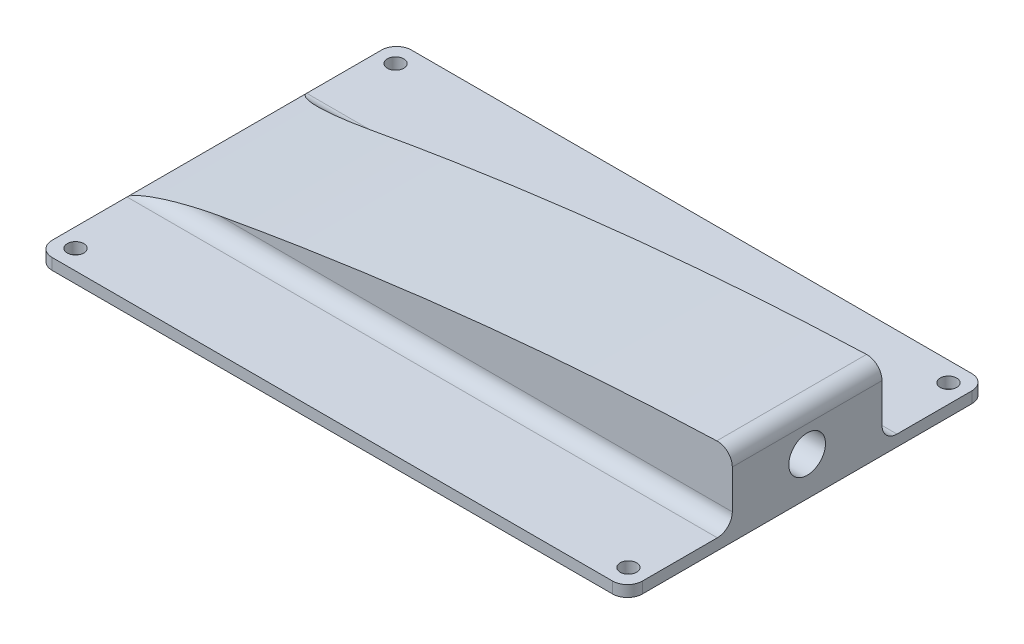
ISO-10303-21;
HEADER;
FILE_DESCRIPTION(('STEP AP214'),'2;1');
FILE_NAME('part.step','',(''),(''),'','','');
FILE_SCHEMA(('AUTOMOTIVE_DESIGN { 1 0 10303 214 1 1 1 1 }'));
ENDSEC;
DATA;
#1=APPLICATION_CONTEXT('core data for automotive mechanical design processes');
#2=APPLICATION_PROTOCOL_DEFINITION('international standard','automotive_design',2000,#1);
#3=PRODUCT_CONTEXT('',#1,'mechanical');
#4=PRODUCT('Part','Part','',(#3));
#5=PRODUCT_RELATED_PRODUCT_CATEGORY('part','',(#4));
#6=PRODUCT_DEFINITION_FORMATION('','',#4);
#7=PRODUCT_DEFINITION_CONTEXT('part definition',#1,'design');
#8=PRODUCT_DEFINITION('design','',#6,#7);
#9=PRODUCT_DEFINITION_SHAPE('','',#8);
#10=(LENGTH_UNIT() NAMED_UNIT(*) SI_UNIT(.MILLI.,.METRE.));
#11=(NAMED_UNIT(*) PLANE_ANGLE_UNIT() SI_UNIT($,.RADIAN.));
#12=(NAMED_UNIT(*) SI_UNIT($,.STERADIAN.) SOLID_ANGLE_UNIT());
#13=UNCERTAINTY_MEASURE_WITH_UNIT(LENGTH_MEASURE(1.E-05),#10,'distance_accuracy_value','');
#14=(GEOMETRIC_REPRESENTATION_CONTEXT(3) GLOBAL_UNCERTAINTY_ASSIGNED_CONTEXT((#13)) GLOBAL_UNIT_ASSIGNED_CONTEXT((#10,
#11,#12)) REPRESENTATION_CONTEXT('',''));
#15=CARTESIAN_POINT('',(0.,0.,0.));
#16=DIRECTION('',(0.,0.,1.));
#17=DIRECTION('',(1.,0.,0.));
#18=AXIS2_PLACEMENT_3D('',#15,#16,#17);
#19=CARTESIAN_POINT('',(0.,1.5,0.));
#20=DIRECTION('',(0.,1.,0.));
#21=DIRECTION('',(0.,0.,1.));
#22=AXIS2_PLACEMENT_3D('',#19,#20,#21);
#23=PLANE('',#22);
#24=CARTESIAN_POINT('',(-36.93,1.5,-21.375));
#25=DIRECTION('',(0.,1.,0.));
#26=DIRECTION('',(0.,0.,1.));
#27=AXIS2_PLACEMENT_3D('',#24,#25,#26);
#28=CIRCLE('',#27,1.1);
#29=CARTESIAN_POINT('',(-36.93,1.5,-20.275));
#30=VERTEX_POINT('',#29);
#31=EDGE_CURVE('E174',#30,#30,#28,.T.);
#32=ORIENTED_EDGE('',*,*,#31,.F.);
#33=EDGE_LOOP('',(#32));
#34=FACE_BOUND('',#33,.T.);
#35=CARTESIAN_POINT('',(36.93,1.5,-21.375));
#36=DIRECTION('',(0.,1.,0.));
#37=DIRECTION('',(0.,0.,1.));
#38=AXIS2_PLACEMENT_3D('',#35,#36,#37);
#39=CIRCLE('',#38,1.1);
#40=CARTESIAN_POINT('',(36.93,1.5,-20.275));
#41=VERTEX_POINT('',#40);
#42=EDGE_CURVE('E276',#41,#41,#39,.T.);
#43=ORIENTED_EDGE('',*,*,#42,.F.);
#44=EDGE_LOOP('',(#43));
#45=FACE_BOUND('',#44,.T.);
#46=DIRECTION('',(0.,0.,1.));
#47=VECTOR('',#46,1.);
#48=CARTESIAN_POINT('',(-39.43,1.5,24.));
#49=LINE('',#48,#47);
#50=CARTESIAN_POINT('',(-39.43,1.5,-22.));
#51=VERTEX_POINT('',#50);
#52=CARTESIAN_POINT('',(-39.43,1.5,-12.));
#53=VERTEX_POINT('',#52);
#54=EDGE_CURVE('E161',#51,#53,#49,.T.);
#55=ORIENTED_EDGE('',*,*,#54,.T.);
#56=DIRECTION('',(1.,0.,0.));
#57=VECTOR('',#56,1.);
#58=CARTESIAN_POINT('',(0.,1.5,-12.));
#59=LINE('',#58,#57);
#60=CARTESIAN_POINT('',(39.43,1.5,-12.));
#61=VERTEX_POINT('',#60);
#62=EDGE_CURVE('E212',#53,#61,#59,.T.);
#63=ORIENTED_EDGE('',*,*,#62,.T.);
#64=DIRECTION('',(0.,0.,-1.));
#65=VECTOR('',#64,1.);
#66=CARTESIAN_POINT('',(39.43,1.5,24.));
#67=LINE('',#66,#65);
#68=CARTESIAN_POINT('',(39.43,1.5,-22.));
#69=VERTEX_POINT('',#68);
#70=EDGE_CURVE('E288',#61,#69,#67,.T.);
#71=ORIENTED_EDGE('',*,*,#70,.T.);
#72=CARTESIAN_POINT('',(37.43,1.5,-22.));
#73=DIRECTION('',(0.,1.,0.));
#74=DIRECTION('',(0.,0.,1.));
#75=AXIS2_PLACEMENT_3D('',#72,#73,#74);
#76=CIRCLE('',#75,2.);
#77=CARTESIAN_POINT('',(37.43,1.5,-24.));
#78=VERTEX_POINT('',#77);
#79=EDGE_CURVE('E197',#69,#78,#76,.T.);
#80=ORIENTED_EDGE('',*,*,#79,.T.);
#81=DIRECTION('',(-1.,0.,0.));
#82=VECTOR('',#81,1.);
#83=CARTESIAN_POINT('',(39.43,1.5,-24.));
#84=LINE('',#83,#82);
#85=CARTESIAN_POINT('',(-37.43,1.5,-24.));
#86=VERTEX_POINT('',#85);
#87=EDGE_CURVE('E177',#78,#86,#84,.T.);
#88=ORIENTED_EDGE('',*,*,#87,.T.);
#89=CARTESIAN_POINT('',(-37.43,1.5,-22.));
#90=DIRECTION('',(0.,1.,0.));
#91=DIRECTION('',(0.,0.,1.));
#92=AXIS2_PLACEMENT_3D('',#89,#90,#91);
#93=CIRCLE('',#92,2.);
#94=EDGE_CURVE('E199',#86,#51,#93,.T.);
#95=ORIENTED_EDGE('',*,*,#94,.T.);
#96=EDGE_LOOP('',(#55,#63,#71,#80,#88,#95));
#97=FACE_BOUND('',#96,.T.);
#98=ADVANCED_FACE('F41',(#34,#45,#97),#23,.T.);
#99=CARTESIAN_POINT('',(-39.43,1.5,24.));
#100=DIRECTION('',(1.,0.,0.));
#101=DIRECTION('',(0.,0.,-1.));
#102=AXIS2_PLACEMENT_3D('',#99,#100,#101);
#103=PLANE('',#102);
#104=DIRECTION('',(0.,0.,1.));
#105=VECTOR('',#104,1.);
#106=CARTESIAN_POINT('',(-39.43,1.5,-10.));
#107=LINE('',#106,#105);
#108=CARTESIAN_POINT('',(-39.43,1.5,12.));
#109=VERTEX_POINT('',#108);
#110=EDGE_CURVE('E258',#53,#109,#107,.T.);
#111=ORIENTED_EDGE('',*,*,#110,.F.);
#112=ORIENTED_EDGE('',*,*,#54,.F.);
#113=DIRECTION('',(0.,-1.,0.));
#114=VECTOR('',#113,1.);
#115=CARTESIAN_POINT('',(-39.43,1.5,-22.));
#116=LINE('',#115,#114);
#117=CARTESIAN_POINT('',(-39.43,0.,-22.));
#118=VERTEX_POINT('',#117);
#119=EDGE_CURVE('E144',#51,#118,#116,.T.);
#120=ORIENTED_EDGE('',*,*,#119,.T.);
#121=DIRECTION('',(0.,0.,1.));
#122=VECTOR('',#121,1.);
#123=CARTESIAN_POINT('',(-39.43,0.,24.));
#124=LINE('',#123,#122);
#125=CARTESIAN_POINT('',(-39.43,0.,22.));
#126=VERTEX_POINT('',#125);
#127=EDGE_CURVE('E158',#118,#126,#124,.T.);
#128=ORIENTED_EDGE('',*,*,#127,.T.);
#129=DIRECTION('',(0.,-1.,0.));
#130=VECTOR('',#129,1.);
#131=CARTESIAN_POINT('',(-39.43,1.5,22.));
#132=LINE('',#131,#130);
#133=CARTESIAN_POINT('',(-39.43,1.5,22.));
#134=VERTEX_POINT('',#133);
#135=EDGE_CURVE('E163',#126,#134,#132,.F.);
#136=ORIENTED_EDGE('',*,*,#135,.T.);
#137=EDGE_CURVE('E184',#109,#134,#49,.T.);
#138=ORIENTED_EDGE('',*,*,#137,.F.);
#139=EDGE_LOOP('',(#111,#112,#120,#128,#136,#138));
#140=FACE_BOUND('',#139,.T.);
#141=ADVANCED_FACE('F156',(#140),#103,.F.);
#142=CARTESIAN_POINT('',(39.43,1.5,24.));
#143=DIRECTION('',(0.,0.,-1.));
#144=DIRECTION('',(-1.,0.,0.));
#145=AXIS2_PLACEMENT_3D('',#142,#143,#144);
#146=PLANE('',#145);
#147=DIRECTION('',(1.,0.,0.));
#148=VECTOR('',#147,1.);
#149=CARTESIAN_POINT('',(39.43,0.,24.));
#150=LINE('',#149,#148);
#151=CARTESIAN_POINT('',(-37.43,0.,24.));
#152=VERTEX_POINT('',#151);
#153=CARTESIAN_POINT('',(37.43,0.,24.));
#154=VERTEX_POINT('',#153);
#155=EDGE_CURVE('E167',#152,#154,#150,.T.);
#156=ORIENTED_EDGE('',*,*,#155,.T.);
#157=DIRECTION('',(0.,-1.,0.));
#158=VECTOR('',#157,1.);
#159=CARTESIAN_POINT('',(37.43,1.5,24.));
#160=LINE('',#159,#158);
#161=CARTESIAN_POINT('',(37.43,1.5,24.));
#162=VERTEX_POINT('',#161);
#163=EDGE_CURVE('E210',#154,#162,#160,.F.);
#164=ORIENTED_EDGE('',*,*,#163,.T.);
#165=DIRECTION('',(1.,0.,0.));
#166=VECTOR('',#165,1.);
#167=CARTESIAN_POINT('',(39.43,1.5,24.));
#168=LINE('',#167,#166);
#169=CARTESIAN_POINT('',(-37.43,1.5,24.));
#170=VERTEX_POINT('',#169);
#171=EDGE_CURVE('E286',#170,#162,#168,.T.);
#172=ORIENTED_EDGE('',*,*,#171,.F.);
#173=DIRECTION('',(0.,-1.,0.));
#174=VECTOR('',#173,1.);
#175=CARTESIAN_POINT('',(-37.43,1.5,24.));
#176=LINE('',#175,#174);
#177=EDGE_CURVE('E207',#170,#152,#176,.T.);
#178=ORIENTED_EDGE('',*,*,#177,.T.);
#179=EDGE_LOOP('',(#156,#164,#172,#178));
#180=FACE_BOUND('',#179,.T.);
#181=ADVANCED_FACE('F314',(#180),#146,.F.);
#182=CARTESIAN_POINT('',(39.43,1.5,24.));
#183=DIRECTION('',(-1.,0.,0.));
#184=DIRECTION('',(0.,0.,1.));
#185=AXIS2_PLACEMENT_3D('',#182,#183,#184);
#186=PLANE('',#185);
#187=CARTESIAN_POINT('',(39.43,5.18228709577426,0.));
#188=DIRECTION('',(1.,0.,0.));
#189=DIRECTION('',(0.,0.,-1.));
#190=AXIS2_PLACEMENT_3D('',#187,#188,#189);
#191=CIRCLE('',#190,2.45);
#192=CARTESIAN_POINT('',(39.43,5.18228709577426,-2.45));
#193=VERTEX_POINT('',#192);
#194=EDGE_CURVE('E396',#193,#193,#191,.T.);
#195=ORIENTED_EDGE('',*,*,#194,.F.);
#196=EDGE_LOOP('',(#195));
#197=FACE_BOUND('',#196,.T.);
#198=DIRECTION('',(0.,1.,0.));
#199=VECTOR('',#198,1.);
#200=CARTESIAN_POINT('',(39.43,0.75,-10.));
#201=LINE('',#200,#199);
#202=CARTESIAN_POINT('',(39.43,3.5,-10.));
#203=VERTEX_POINT('',#202);
#204=CARTESIAN_POINT('',(39.43,8.68228709577425,-10.));
#205=VERTEX_POINT('',#204);
#206=EDGE_CURVE('E259',#203,#205,#201,.T.);
#207=ORIENTED_EDGE('',*,*,#206,.T.);
#208=DIRECTION('',(0.,0.,-1.));
#209=VECTOR('',#208,1.);
#210=CARTESIAN_POINT('',(39.43,8.68228709577425,10.));
#211=LINE('',#210,#209);
#212=CARTESIAN_POINT('',(39.43,8.68228709577425,10.));
#213=VERTEX_POINT('',#212);
#214=EDGE_CURVE('E328',#205,#213,#211,.F.);
#215=ORIENTED_EDGE('',*,*,#214,.T.);
#216=DIRECTION('',(0.,1.,0.));
#217=VECTOR('',#216,1.);
#218=CARTESIAN_POINT('',(39.43,0.75,10.));
#219=LINE('',#218,#217);
#220=CARTESIAN_POINT('',(39.43,3.5,10.));
#221=VERTEX_POINT('',#220);
#222=EDGE_CURVE('E323',#221,#213,#219,.T.);
#223=ORIENTED_EDGE('',*,*,#222,.F.);
#224=CARTESIAN_POINT('',(39.43,3.5,12.));
#225=DIRECTION('',(-1.,0.,0.));
#226=DIRECTION('',(0.,0.,1.));
#227=AXIS2_PLACEMENT_3D('',#224,#225,#226);
#228=CIRCLE('',#227,2.);
#229=CARTESIAN_POINT('',(39.43,1.5,12.));
#230=VERTEX_POINT('',#229);
#231=EDGE_CURVE('E235',#221,#230,#228,.T.);
#232=ORIENTED_EDGE('',*,*,#231,.T.);
#233=CARTESIAN_POINT('',(39.43,1.5,22.));
#234=VERTEX_POINT('',#233);
#235=EDGE_CURVE('E289',#234,#230,#67,.T.);
#236=ORIENTED_EDGE('',*,*,#235,.F.);
#237=DIRECTION('',(0.,-1.,0.));
#238=VECTOR('',#237,1.);
#239=CARTESIAN_POINT('',(39.43,1.5,22.));
#240=LINE('',#239,#238);
#241=CARTESIAN_POINT('',(39.43,0.,22.));
#242=VERTEX_POINT('',#241);
#243=EDGE_CURVE('E201',#234,#242,#240,.T.);
#244=ORIENTED_EDGE('',*,*,#243,.T.);
#245=DIRECTION('',(0.,0.,-1.));
#246=VECTOR('',#245,1.);
#247=CARTESIAN_POINT('',(39.43,0.,24.));
#248=LINE('',#247,#246);
#249=CARTESIAN_POINT('',(39.43,0.,-22.));
#250=VERTEX_POINT('',#249);
#251=EDGE_CURVE('E171',#242,#250,#248,.T.);
#252=ORIENTED_EDGE('',*,*,#251,.T.);
#253=DIRECTION('',(0.,-1.,0.));
#254=VECTOR('',#253,1.);
#255=CARTESIAN_POINT('',(39.43,1.5,-22.));
#256=LINE('',#255,#254);
#257=EDGE_CURVE('E204',#250,#69,#256,.F.);
#258=ORIENTED_EDGE('',*,*,#257,.T.);
#259=ORIENTED_EDGE('',*,*,#70,.F.);
#260=CARTESIAN_POINT('',(39.43,3.5,-12.));
#261=DIRECTION('',(-1.,0.,0.));
#262=DIRECTION('',(0.,0.,1.));
#263=AXIS2_PLACEMENT_3D('',#260,#261,#262);
#264=CIRCLE('',#263,2.);
#265=EDGE_CURVE('E224',#61,#203,#264,.T.);
#266=ORIENTED_EDGE('',*,*,#265,.T.);
#267=EDGE_LOOP('',(#207,#215,#223,#232,#236,#244,#252,#258,#259,#266));
#268=FACE_BOUND('',#267,.T.);
#269=ADVANCED_FACE('F303',(#197,#268),#186,.F.);
#270=CARTESIAN_POINT('',(39.43,1.5,-24.));
#271=DIRECTION('',(0.,0.,1.));
#272=DIRECTION('',(1.,0.,0.));
#273=AXIS2_PLACEMENT_3D('',#270,#271,#272);
#274=PLANE('',#273);
#275=DIRECTION('',(-1.,0.,0.));
#276=VECTOR('',#275,1.);
#277=CARTESIAN_POINT('',(39.43,0.,-24.));
#278=LINE('',#277,#276);
#279=CARTESIAN_POINT('',(37.43,0.,-24.));
#280=VERTEX_POINT('',#279);
#281=CARTESIAN_POINT('',(-37.43,0.,-24.));
#282=VERTEX_POINT('',#281);
#283=EDGE_CURVE('E182',#280,#282,#278,.T.);
#284=ORIENTED_EDGE('',*,*,#283,.T.);
#285=DIRECTION('',(0.,-1.,0.));
#286=VECTOR('',#285,1.);
#287=CARTESIAN_POINT('',(-37.43,1.5,-24.));
#288=LINE('',#287,#286);
#289=EDGE_CURVE('E145',#282,#86,#288,.F.);
#290=ORIENTED_EDGE('',*,*,#289,.T.);
#291=ORIENTED_EDGE('',*,*,#87,.F.);
#292=DIRECTION('',(0.,-1.,0.));
#293=VECTOR('',#292,1.);
#294=CARTESIAN_POINT('',(37.43,1.5,-24.));
#295=LINE('',#294,#293);
#296=EDGE_CURVE('E150',#78,#280,#295,.T.);
#297=ORIENTED_EDGE('',*,*,#296,.T.);
#298=EDGE_LOOP('',(#284,#290,#291,#297));
#299=FACE_BOUND('',#298,.T.);
#300=ADVANCED_FACE('F309',(#299),#274,.F.);
#301=ORIENTED_EDGE('',*,*,#235,.T.);
#302=DIRECTION('',(1.,0.,0.));
#303=VECTOR('',#302,1.);
#304=CARTESIAN_POINT('',(-39.43,1.5,12.));
#305=LINE('',#304,#303);
#306=EDGE_CURVE('E221',#230,#109,#305,.F.);
#307=ORIENTED_EDGE('',*,*,#306,.T.);
#308=ORIENTED_EDGE('',*,*,#137,.T.);
#309=CARTESIAN_POINT('',(-37.43,1.5,22.));
#310=DIRECTION('',(0.,1.,0.));
#311=DIRECTION('',(0.,0.,1.));
#312=AXIS2_PLACEMENT_3D('',#309,#310,#311);
#313=CIRCLE('',#312,2.);
#314=EDGE_CURVE('E193',#134,#170,#313,.T.);
#315=ORIENTED_EDGE('',*,*,#314,.T.);
#316=ORIENTED_EDGE('',*,*,#171,.T.);
#317=CARTESIAN_POINT('',(37.43,1.5,22.));
#318=DIRECTION('',(0.,1.,0.));
#319=DIRECTION('',(0.,0.,1.));
#320=AXIS2_PLACEMENT_3D('',#317,#318,#319);
#321=CIRCLE('',#320,2.);
#322=EDGE_CURVE('E195',#162,#234,#321,.T.);
#323=ORIENTED_EDGE('',*,*,#322,.T.);
#324=EDGE_LOOP('',(#301,#307,#308,#315,#316,#323));
#325=FACE_BOUND('',#324,.T.);
#326=CARTESIAN_POINT('',(-36.93,1.5,21.375));
#327=DIRECTION('',(0.,1.,0.));
#328=DIRECTION('',(0.,0.,1.));
#329=AXIS2_PLACEMENT_3D('',#326,#327,#328);
#330=CIRCLE('',#329,1.1);
#331=CARTESIAN_POINT('',(-36.93,1.5,22.475));
#332=VERTEX_POINT('',#331);
#333=EDGE_CURVE('E275',#332,#332,#330,.T.);
#334=ORIENTED_EDGE('',*,*,#333,.F.);
#335=EDGE_LOOP('',(#334));
#336=FACE_BOUND('',#335,.T.);
#337=CARTESIAN_POINT('',(36.93,1.5,21.375));
#338=DIRECTION('',(0.,1.,0.));
#339=DIRECTION('',(0.,0.,1.));
#340=AXIS2_PLACEMENT_3D('',#337,#338,#339);
#341=CIRCLE('',#340,1.1);
#342=CARTESIAN_POINT('',(36.93,1.5,22.475));
#343=VERTEX_POINT('',#342);
#344=EDGE_CURVE('E268',#343,#343,#341,.T.);
#345=ORIENTED_EDGE('',*,*,#344,.F.);
#346=EDGE_LOOP('',(#345));
#347=FACE_BOUND('',#346,.T.);
#348=ADVANCED_FACE('F319',(#325,#336,#347),#23,.T.);
#349=CARTESIAN_POINT('',(0.,0.,0.));
#350=DIRECTION('',(0.,1.,0.));
#351=DIRECTION('',(0.,0.,1.));
#352=AXIS2_PLACEMENT_3D('',#349,#350,#351);
#353=PLANE('',#352);
#354=CARTESIAN_POINT('',(-36.93,0.,21.375));
#355=DIRECTION('',(0.,1.,0.));
#356=DIRECTION('',(0.,0.,1.));
#357=AXIS2_PLACEMENT_3D('',#354,#355,#356);
#358=CIRCLE('',#357,1.1);
#359=CARTESIAN_POINT('',(-36.93,0.,22.475));
#360=VERTEX_POINT('',#359);
#361=EDGE_CURVE('E272',#360,#360,#358,.F.);
#362=ORIENTED_EDGE('',*,*,#361,.F.);
#363=EDGE_LOOP('',(#362));
#364=FACE_BOUND('',#363,.T.);
#365=CARTESIAN_POINT('',(36.93,0.,-21.375));
#366=DIRECTION('',(0.,1.,0.));
#367=DIRECTION('',(0.,0.,1.));
#368=AXIS2_PLACEMENT_3D('',#365,#366,#367);
#369=CIRCLE('',#368,1.1);
#370=CARTESIAN_POINT('',(36.93,0.,-20.275));
#371=VERTEX_POINT('',#370);
#372=EDGE_CURVE('E271',#371,#371,#369,.F.);
#373=ORIENTED_EDGE('',*,*,#372,.F.);
#374=EDGE_LOOP('',(#373));
#375=FACE_BOUND('',#374,.T.);
#376=CARTESIAN_POINT('',(36.93,0.,21.375));
#377=DIRECTION('',(0.,1.,0.));
#378=DIRECTION('',(0.,0.,1.));
#379=AXIS2_PLACEMENT_3D('',#376,#377,#378);
#380=CIRCLE('',#379,1.1);
#381=CARTESIAN_POINT('',(36.93,0.,22.475));
#382=VERTEX_POINT('',#381);
#383=EDGE_CURVE('E265',#382,#382,#380,.F.);
#384=ORIENTED_EDGE('',*,*,#383,.F.);
#385=EDGE_LOOP('',(#384));
#386=FACE_BOUND('',#385,.T.);
#387=CARTESIAN_POINT('',(-36.93,0.,-21.375));
#388=DIRECTION('',(0.,1.,0.));
#389=DIRECTION('',(0.,0.,1.));
#390=AXIS2_PLACEMENT_3D('',#387,#388,#389);
#391=CIRCLE('',#390,1.1);
#392=CARTESIAN_POINT('',(-36.93,0.,-20.275));
#393=VERTEX_POINT('',#392);
#394=EDGE_CURVE('E168',#393,#393,#391,.F.);
#395=ORIENTED_EDGE('',*,*,#394,.F.);
#396=EDGE_LOOP('',(#395));
#397=FACE_BOUND('',#396,.T.);
#398=ORIENTED_EDGE('',*,*,#127,.F.);
#399=CARTESIAN_POINT('',(-37.43,0.,-22.));
#400=DIRECTION('',(0.,1.,0.));
#401=DIRECTION('',(0.,0.,1.));
#402=AXIS2_PLACEMENT_3D('',#399,#400,#401);
#403=CIRCLE('',#402,2.);
#404=EDGE_CURVE('E140',#118,#282,#403,.F.);
#405=ORIENTED_EDGE('',*,*,#404,.T.);
#406=ORIENTED_EDGE('',*,*,#283,.F.);
#407=CARTESIAN_POINT('',(37.43,0.,-22.));
#408=DIRECTION('',(0.,1.,0.));
#409=DIRECTION('',(0.,0.,1.));
#410=AXIS2_PLACEMENT_3D('',#407,#408,#409);
#411=CIRCLE('',#410,2.);
#412=EDGE_CURVE('E151',#280,#250,#411,.F.);
#413=ORIENTED_EDGE('',*,*,#412,.T.);
#414=ORIENTED_EDGE('',*,*,#251,.F.);
#415=CARTESIAN_POINT('',(37.43,0.,22.));
#416=DIRECTION('',(0.,1.,0.));
#417=DIRECTION('',(0.,0.,1.));
#418=AXIS2_PLACEMENT_3D('',#415,#416,#417);
#419=CIRCLE('',#418,2.);
#420=EDGE_CURVE('E187',#242,#154,#419,.F.);
#421=ORIENTED_EDGE('',*,*,#420,.T.);
#422=ORIENTED_EDGE('',*,*,#155,.F.);
#423=CARTESIAN_POINT('',(-37.43,0.,22.));
#424=DIRECTION('',(0.,1.,0.));
#425=DIRECTION('',(0.,0.,1.));
#426=AXIS2_PLACEMENT_3D('',#423,#424,#425);
#427=CIRCLE('',#426,2.);
#428=EDGE_CURVE('E162',#152,#126,#427,.F.);
#429=ORIENTED_EDGE('',*,*,#428,.T.);
#430=EDGE_LOOP('',(#398,#405,#406,#413,#414,#421,#422,#429));
#431=FACE_BOUND('',#430,.T.);
#432=ADVANCED_FACE('F165',(#364,#375,#386,#397,#431),#353,.F.);
#433=CARTESIAN_POINT('',(-36.93,-0.000999999999999916,-21.375));
#434=DIRECTION('',(0.,1.,0.));
#435=DIRECTION('',(0.,0.,1.));
#436=AXIS2_PLACEMENT_3D('',#433,#434,#435);
#437=CYLINDRICAL_SURFACE('',#436,1.1);
#438=ORIENTED_EDGE('',*,*,#31,.T.);
#439=EDGE_LOOP('',(#438));
#440=FACE_BOUND('',#439,.T.);
#441=ORIENTED_EDGE('',*,*,#394,.T.);
#442=EDGE_LOOP('',(#441));
#443=FACE_BOUND('',#442,.T.);
#444=ADVANCED_FACE('F364',(#440,#443),#437,.F.);
#445=CARTESIAN_POINT('',(36.93,-0.000999999999999916,21.375));
#446=DIRECTION('',(0.,1.,0.));
#447=DIRECTION('',(0.,0.,1.));
#448=AXIS2_PLACEMENT_3D('',#445,#446,#447);
#449=CYLINDRICAL_SURFACE('',#448,1.1);
#450=ORIENTED_EDGE('',*,*,#344,.T.);
#451=EDGE_LOOP('',(#450));
#452=FACE_BOUND('',#451,.T.);
#453=ORIENTED_EDGE('',*,*,#383,.T.);
#454=EDGE_LOOP('',(#453));
#455=FACE_BOUND('',#454,.T.);
#456=ADVANCED_FACE('F249',(#452,#455),#449,.F.);
#457=CARTESIAN_POINT('',(36.93,-0.000999999999999916,-21.375));
#458=DIRECTION('',(0.,1.,0.));
#459=DIRECTION('',(0.,0.,1.));
#460=AXIS2_PLACEMENT_3D('',#457,#458,#459);
#461=CYLINDRICAL_SURFACE('',#460,1.1);
#462=ORIENTED_EDGE('',*,*,#42,.T.);
#463=EDGE_LOOP('',(#462));
#464=FACE_BOUND('',#463,.T.);
#465=ORIENTED_EDGE('',*,*,#372,.T.);
#466=EDGE_LOOP('',(#465));
#467=FACE_BOUND('',#466,.T.);
#468=ADVANCED_FACE('F480',(#464,#467),#461,.F.);
#469=CARTESIAN_POINT('',(-36.93,-0.000999999999999916,21.375));
#470=DIRECTION('',(0.,1.,0.));
#471=DIRECTION('',(0.,0.,1.));
#472=AXIS2_PLACEMENT_3D('',#469,#470,#471);
#473=CYLINDRICAL_SURFACE('',#472,1.1);
#474=ORIENTED_EDGE('',*,*,#333,.T.);
#475=EDGE_LOOP('',(#474));
#476=FACE_BOUND('',#475,.T.);
#477=ORIENTED_EDGE('',*,*,#361,.T.);
#478=EDGE_LOOP('',(#477));
#479=FACE_BOUND('',#478,.T.);
#480=ADVANCED_FACE('F378',(#476,#479),#473,.F.);
#481=CARTESIAN_POINT('',(-37.43,1.5,-22.));
#482=DIRECTION('',(0.,-1.,0.));
#483=DIRECTION('',(0.,0.,-1.));
#484=AXIS2_PLACEMENT_3D('',#481,#482,#483);
#485=CYLINDRICAL_SURFACE('',#484,2.);
#486=ORIENTED_EDGE('',*,*,#94,.F.);
#487=ORIENTED_EDGE('',*,*,#289,.F.);
#488=ORIENTED_EDGE('',*,*,#404,.F.);
#489=ORIENTED_EDGE('',*,*,#119,.F.);
#490=EDGE_LOOP('',(#486,#487,#488,#489));
#491=FACE_BOUND('',#490,.T.);
#492=ADVANCED_FACE('F143',(#491),#485,.T.);
#493=CARTESIAN_POINT('',(37.43,1.5,-22.));
#494=DIRECTION('',(0.,-1.,0.));
#495=DIRECTION('',(0.,0.,-1.));
#496=AXIS2_PLACEMENT_3D('',#493,#494,#495);
#497=CYLINDRICAL_SURFACE('',#496,2.);
#498=ORIENTED_EDGE('',*,*,#79,.F.);
#499=ORIENTED_EDGE('',*,*,#257,.F.);
#500=ORIENTED_EDGE('',*,*,#412,.F.);
#501=ORIENTED_EDGE('',*,*,#296,.F.);
#502=EDGE_LOOP('',(#498,#499,#500,#501));
#503=FACE_BOUND('',#502,.T.);
#504=ADVANCED_FACE('F307',(#503),#497,.T.);
#505=CARTESIAN_POINT('',(37.43,1.5,22.));
#506=DIRECTION('',(0.,-1.,0.));
#507=DIRECTION('',(0.,0.,-1.));
#508=AXIS2_PLACEMENT_3D('',#505,#506,#507);
#509=CYLINDRICAL_SURFACE('',#508,2.);
#510=ORIENTED_EDGE('',*,*,#322,.F.);
#511=ORIENTED_EDGE('',*,*,#163,.F.);
#512=ORIENTED_EDGE('',*,*,#420,.F.);
#513=ORIENTED_EDGE('',*,*,#243,.F.);
#514=EDGE_LOOP('',(#510,#511,#512,#513));
#515=FACE_BOUND('',#514,.T.);
#516=ADVANCED_FACE('F318',(#515),#509,.T.);
#517=CARTESIAN_POINT('',(-37.43,1.5,22.));
#518=DIRECTION('',(0.,-1.,0.));
#519=DIRECTION('',(0.,0.,-1.));
#520=AXIS2_PLACEMENT_3D('',#517,#518,#519);
#521=CYLINDRICAL_SURFACE('',#520,2.);
#522=ORIENTED_EDGE('',*,*,#314,.F.);
#523=ORIENTED_EDGE('',*,*,#135,.F.);
#524=ORIENTED_EDGE('',*,*,#428,.F.);
#525=ORIENTED_EDGE('',*,*,#177,.F.);
#526=EDGE_LOOP('',(#522,#523,#524,#525));
#527=FACE_BOUND('',#526,.T.);
#528=ADVANCED_FACE('F247',(#527),#521,.T.);
#529=CARTESIAN_POINT('',(39.43,10.75,-10.));
#530=CARTESIAN_POINT('',(-0.251175804074629,9.51719352446353,-10.));
#531=CARTESIAN_POINT('',(-39.43,1.5,-10.));
#532=B_SPLINE_CURVE_WITH_KNOTS('',2,(#529,#530,#531),.UNSPECIFIED.,.F.,.F.,(3,3),(0.,1.),.UNSPECIFIED.);
#533=DIRECTION('',(0.,0.,1.));
#534=VECTOR('',#533,1.);
#535=SURFACE_OF_LINEAR_EXTRUSION('',#532,#534);
#536=CARTESIAN_POINT('',(39.43,10.75,10.));
#537=CARTESIAN_POINT('',(-0.251175804074629,9.51719352446353,10.));
#538=CARTESIAN_POINT('',(-39.43,1.5,10.));
#539=B_SPLINE_CURVE_WITH_KNOTS('',2,(#536,#537,#538),.UNSPECIFIED.,.F.,.F.,(3,3),(0.,1.),.UNSPECIFIED.);
#540=CARTESIAN_POINT('',(37.3589609217113,10.6810250599296,10.));
#541=VERTEX_POINT('',#540);
#542=CARTESIAN_POINT('',(-29.0688226467254,3.50000000629786,10.));
#543=VERTEX_POINT('',#542);
#544=EDGE_CURVE('E387',#541,#543,#539,.T.);
#545=ORIENTED_EDGE('',*,*,#544,.F.);
#546=DIRECTION('',(0.,0.,1.));
#547=VECTOR('',#546,1.);
#548=CARTESIAN_POINT('',(37.3589609217113,10.6810250599296,10.));
#549=LINE('',#548,#547);
#550=CARTESIAN_POINT('',(37.3589609217113,10.6810250599296,-10.));
#551=VERTEX_POINT('',#550);
#552=EDGE_CURVE('E49',#541,#551,#549,.F.);
#553=ORIENTED_EDGE('',*,*,#552,.T.);
#554=CARTESIAN_POINT('',(-29.0688226467254,3.50000000629786,-10.));
#555=VERTEX_POINT('',#554);
#556=EDGE_CURVE('E252',#551,#555,#532,.T.);
#557=ORIENTED_EDGE('',*,*,#556,.T.);
#558=CARTESIAN_POINT('',(-29.0688226455827,3.5,-10.));
#559=CARTESIAN_POINT('',(-29.3969379724581,3.44046516010893,-10.000025804989));
#560=CARTESIAN_POINT('',(-29.7249956634501,3.38058001251543,-10.0026599576182));
#561=CARTESIAN_POINT('',(-30.3809341467354,3.2601217576977,-10.0135096254264));
#562=CARTESIAN_POINT('',(-30.7088149114785,3.19954856460472,-10.021725844948));
#563=CARTESIAN_POINT('',(-31.3644638889006,3.07770310029556,-10.0441116216866));
#564=CARTESIAN_POINT('',(-31.6922318967006,3.01643040818184,-10.0582849694083));
#565=CARTESIAN_POINT('',(-32.3472829796097,2.89325672910025,-10.0931805218178));
#566=CARTESIAN_POINT('',(-32.6745660814996,2.83135577843483,-10.1139023501789));
#567=CARTESIAN_POINT('',(-33.3632849608852,2.70033949394854,-10.1653268921091));
#568=CARTESIAN_POINT('',(-33.7246483530669,2.63115750775416,-10.1968571489356));
#569=CARTESIAN_POINT('',(-34.265748546123,2.52691116599036,-10.2522478560926));
#570=CARTESIAN_POINT('',(-34.4459492422039,2.49208516011851,-10.2720595101517));
#571=CARTESIAN_POINT('',(-34.8059637305558,2.42229057175545,-10.3147057465863));
#572=CARTESIAN_POINT('',(-34.9857775296086,2.38732199179493,-10.3375402755301));
#573=CARTESIAN_POINT('',(-35.4106915272181,2.30443255250215,-10.3956184569114));
#574=CARTESIAN_POINT('',(-35.6555815944016,2.25645880608201,-10.432343869181));
#575=CARTESIAN_POINT('',(-36.144032467912,2.16037166635678,-10.5136038740061));
#576=CARTESIAN_POINT('',(-36.387593431206,2.11225829061706,-10.5581375228859));
#577=CARTESIAN_POINT('',(-36.7965886435571,2.03113257806891,-10.6418150804703));
#578=CARTESIAN_POINT('',(-36.9625704663415,1.99811625753867,-10.6782695606363));
#579=CARTESIAN_POINT('',(-37.2931749474863,1.93217083840456,-10.7571909695299));
#580=CARTESIAN_POINT('',(-37.4577973878385,1.89924175434488,-10.799658843559));
#581=CARTESIAN_POINT('',(-37.7343889264583,1.84376444810419,-10.878206899272));
#582=CARTESIAN_POINT('',(-37.846930935778,1.82114830628897,-10.9122146422758));
#583=CARTESIAN_POINT('',(-38.0704313471719,1.77615063693514,-10.9850192036025));
#584=CARTESIAN_POINT('',(-38.1813909439082,1.75376893620724,-11.0238121695789));
#585=CARTESIAN_POINT('',(-38.3677911129757,1.71610184337448,-11.095124489662));
#586=CARTESIAN_POINT('',(-38.4438378405145,1.70071479536568,-11.1260000571523));
#587=CARTESIAN_POINT('',(-38.5944362586794,1.6702053880416,-11.1918050290827));
#588=CARTESIAN_POINT('',(-38.6689846715177,1.65508361666518,-11.2267423816938));
#589=CARTESIAN_POINT('',(-38.7814167536775,1.63225002100393,-11.2844763920913));
#590=CARTESIAN_POINT('',(-38.8202403043078,1.62436023827003,-11.3053703789846));
#591=CARTESIAN_POINT('',(-38.8968779025537,1.60877605394076,-11.3489930399988));
#592=CARTESIAN_POINT('',(-38.9346922315092,1.60108159792417,-11.3717211955486));
#593=CARTESIAN_POINT('',(-39.0088380503012,1.58598528500827,-11.4193366848722));
#594=CARTESIAN_POINT('',(-39.0451737902675,1.57858259171472,-11.444217075946));
#595=CARTESIAN_POINT('',(-39.1158788039165,1.56416958782562,-11.4967082051123));
#596=CARTESIAN_POINT('',(-39.150250047012,1.55715888441817,-11.5243161302769));
#597=CARTESIAN_POINT('',(-39.2094354855909,1.54508049788164,-11.5770741696812));
#598=CARTESIAN_POINT('',(-39.2347797406392,1.53990597438251,-11.6015983150384));
#599=CARTESIAN_POINT('',(-39.2828298177108,1.53009190262736,-11.6533625474603));
#600=CARTESIAN_POINT('',(-39.3055296644149,1.52545356611725,-11.6806085365032));
#601=CARTESIAN_POINT('',(-39.3472742509974,1.51692105410427,-11.7387007543598));
#602=CARTESIAN_POINT('',(-39.3662474023746,1.51304145887612,-11.7696020422439));
#603=CARTESIAN_POINT('',(-39.3977760017618,1.50659314090951,-11.8345551154858));
#604=CARTESIAN_POINT('',(-39.4103785157652,1.50401480476103,-11.8685815336451));
#605=CARTESIAN_POINT('',(-39.4223572903062,1.50156388350106,-11.919360640857));
#606=CARTESIAN_POINT('',(-39.4251946085465,1.50098331172583,-11.9352864456953));
#607=CARTESIAN_POINT('',(-39.4290276911439,1.50019896488217,-11.967467223886));
#608=CARTESIAN_POINT('',(-39.4300117584383,1.499997583128,-11.9837236377165));
#609=CARTESIAN_POINT('',(-39.43,1.5,-12.));
#610=B_SPLINE_CURVE_WITH_KNOTS('',3,(#558,#559,#560,#561,#562,#563,#564,#565,#566,#567,#568,
#569,#570,#571,#572,#573,#574,#575,#576,#577,#578,#579,#580,#581,#582,#583,#584,#585,#586,#587,
#588,#589,#590,#591,#592,#593,#594,#595,#596,#597,#598,#599,#600,#601,#602,#603,#604,#605,#606,
#607,#608,#609),.UNSPECIFIED.,.F.,.F.,(4,2,2,2,2,2,2,2,2,2,2,2,2,2,2,2,2,2,2,2,2,2,2,2,2,4),(0.,
1.00041643978347,2.00095913510958,3.00213943919429,4.00326221811334,5.11093466363947,
5.66471818515427,6.21849191943067,6.97509546032414,7.73160762375525,8.25087787008432,
8.77022983615937,9.12932821198365,9.48813935942793,9.7385823522057,9.9895239371518,
10.1238546081881,10.2581474323383,10.392022148936,10.52576021279,10.6325458312364,
10.7395682455673,10.8484797100424,10.9565743303985,11.0050327150124,11.0537959398524),.UNSPECIFIED.);
#611=EDGE_CURVE('E226',#555,#53,#610,.T.);
#612=ORIENTED_EDGE('',*,*,#611,.T.);
#613=ORIENTED_EDGE('',*,*,#110,.T.);
#614=CARTESIAN_POINT('',(-39.43,1.5,12.));
#615=CARTESIAN_POINT('',(-39.4300043499535,1.4999991063021,11.9876311476411));
#616=CARTESIAN_POINT('',(-39.429438874984,1.50011482370424,11.9752693518608));
#617=CARTESIAN_POINT('',(-39.427209836558,1.50057094678141,11.9506651650974));
#618=CARTESIAN_POINT('',(-39.425547711052,1.50091105822642,11.938422639028));
#619=CARTESIAN_POINT('',(-39.4190352016067,1.50224362198136,11.9023097792735));
#620=CARTESIAN_POINT('',(-39.4126562285498,1.50354880777794,11.878716974127));
#621=CARTESIAN_POINT('',(-39.3939627166319,1.50737300403518,11.8258068857459));
#622=CARTESIAN_POINT('',(-39.3804285054649,1.51014137356967,11.7969500166114));
#623=CARTESIAN_POINT('',(-39.3490482093178,1.51655815388318,11.7416570678785));
#624=CARTESIAN_POINT('',(-39.3311768881581,1.52021171507895,11.7152364533311));
#625=CARTESIAN_POINT('',(-39.2945695924409,1.52769299259177,11.6675515681729));
#626=CARTESIAN_POINT('',(-39.2761373233262,1.53145890338872,11.6460388043612));
#627=CARTESIAN_POINT('',(-39.2375323832514,1.53934366679558,11.6046898443317));
#628=CARTESIAN_POINT('',(-39.2173582155564,1.54346282291221,11.584855119536));
#629=CARTESIAN_POINT('',(-39.1756977694525,1.55196601528991,11.5466265773136));
#630=CARTESIAN_POINT('',(-39.1542096148395,1.55635043020696,11.5282349101084));
#631=CARTESIAN_POINT('',(-39.1102633189956,1.56531384229004,11.4927288366072));
#632=CARTESIAN_POINT('',(-39.0878055427732,1.56989276622397,11.4756139561775));
#633=CARTESIAN_POINT('',(-39.0286586666137,1.58194760021461,11.4327028000411));
#634=CARTESIAN_POINT('',(-38.9913889016252,1.58953916326565,11.4077405617397));
#635=CARTESIAN_POINT('',(-38.9154989422886,1.60498747307606,11.3600368611802));
#636=CARTESIAN_POINT('',(-38.8768779973161,1.61284436714851,11.3372966608201));
#637=CARTESIAN_POINT('',(-38.7594201816063,1.63672378610579,11.271725228826));
#638=CARTESIAN_POINT('',(-38.6791158973654,1.65302904190406,11.2316305973488));
#639=CARTESIAN_POINT('',(-38.5158077501469,1.6861420974221,11.1564351803181));
#640=CARTESIAN_POINT('',(-38.4327912407976,1.70295220841941,11.121363760191));
#641=CARTESIAN_POINT('',(-38.2653484551075,1.73681020077061,11.0552579732132));
#642=CARTESIAN_POINT('',(-38.1809240507944,1.75385776208712,11.0242186634618));
#643=CARTESIAN_POINT('',(-38.0030474821381,1.78972461818206,10.9625284013507));
#644=CARTESIAN_POINT('',(-37.9094920136225,1.80855996370653,10.9321876093337));
#645=CARTESIAN_POINT('',(-37.721467207222,1.84635488184386,10.8745487690194));
#646=CARTESIAN_POINT('',(-37.6269977427661,1.86531447154137,10.8472511488925));
#647=CARTESIAN_POINT('',(-37.3423030068493,1.92236018614809,10.7690466937003));
#648=CARTESIAN_POINT('',(-37.1510626636035,1.96055854899948,10.721918434351));
#649=CARTESIAN_POINT('',(-36.7666478384157,2.03709204771268,10.6349966280385));
#650=CARTESIAN_POINT('',(-36.573470673977,2.07542730534912,10.5952153796936));
#651=CARTESIAN_POINT('',(-36.1859493166125,2.15207627794633,10.5215115463583));
#652=CARTESIAN_POINT('',(-35.9916048192224,2.19038998415837,10.4875905652032));
#653=CARTESIAN_POINT('',(-35.6019034369193,2.26696142007458,10.4245399222192));
#654=CARTESIAN_POINT('',(-35.4065456546044,2.30521903721326,10.3954157311775));
#655=CARTESIAN_POINT('',(-35.0154869119764,2.38154407871864,10.3413136510145));
#656=CARTESIAN_POINT('',(-34.8197867058049,2.41961168327962,10.3163305274906));
#657=CARTESIAN_POINT('',(-34.4280551933064,2.49555328221945,10.2699526006801));
#658=CARTESIAN_POINT('',(-34.2320241690755,2.53342738240767,10.2485555724092));
#659=CARTESIAN_POINT('',(-33.8396268464959,2.60898168686744,10.2089374150061));
#660=CARTESIAN_POINT('',(-33.6432605843438,2.64666191050208,10.1907159624999));
#661=CARTESIAN_POINT('',(-33.2640841256864,2.71917091009245,10.158324419109));
#662=CARTESIAN_POINT('',(-33.0812931321731,2.7540136217348,10.1439593863028));
#663=CARTESIAN_POINT('',(-32.7154575977748,2.82352280317903,10.1175118418916));
#664=CARTESIAN_POINT('',(-32.5324129984076,2.85818921850472,10.1054299985055));
#665=CARTESIAN_POINT('',(-32.1661189981442,2.92733577803721,10.0833955806677));
#666=CARTESIAN_POINT('',(-31.9828695608757,2.9618158793016,10.073443478257));
#667=CARTESIAN_POINT('',(-31.6162128618764,3.03058034444349,10.0555444279786));
#668=CARTESIAN_POINT('',(-31.4328055833657,3.06486468346979,10.0475977293906));
#669=CARTESIAN_POINT('',(-31.0677359511446,3.13288262364368,10.0336791696132));
#670=CARTESIAN_POINT('',(-30.8860747087426,3.16661828803732,10.0276881494738));
#671=CARTESIAN_POINT('',(-30.52268733487,3.2338803587087,10.0174922430699));
#672=CARTESIAN_POINT('',(-30.3409612144865,3.26740679086626,10.0132871314131));
#673=CARTESIAN_POINT('',(-29.9774898091348,3.33424182989035,10.0065977724617));
#674=CARTESIAN_POINT('',(-29.7957445435844,3.36755049479636,10.0041130464438));
#675=CARTESIAN_POINT('',(-29.4322800472266,3.43394176822185,10.0008156549779));
#676=CARTESIAN_POINT('',(-29.2505608400883,3.46702446966695,10.0000022550734));
#677=CARTESIAN_POINT('',(-29.0688226467849,3.50000000628706,10.));
#678=B_SPLINE_CURVE_WITH_KNOTS('',3,(#614,#615,#616,#617,#618,#619,#620,#621,#622,#623,#624,
#625,#626,#627,#628,#629,#630,#631,#632,#633,#634,#635,#636,#637,#638,#639,#640,#641,#642,#643,
#644,#645,#646,#647,#648,#649,#650,#651,#652,#653,#654,#655,#656,#657,#658,#659,#660,#661,#662,
#663,#664,#665,#666,#667,#668,#669,#670,#671,#672,#673,#674,#675,#676,#677),.UNSPECIFIED.,.F.,
.F.,(4,2,2,2,2,2,2,2,2,2,2,2,2,2,2,2,2,2,2,2,2,2,2,2,2,2,2,2,2,2,2,4),(0.,0.0370802977887394,
0.0741120715108196,0.14717889092888,0.242629024053242,0.338648457801002,0.424259810762602,
0.509945472042609,0.595756475462452,0.681535452756396,0.817911886340486,0.954365323556012,
1.22774064990721,1.50265403499099,1.77722716215073,2.07758330084926,2.37798164608175,
2.97965027765924,3.58231712731241,4.18514865416465,4.7886630254745,5.39140862549604,
5.99377885778505,6.59608771385381,7.15598003782989,7.7160359720394,8.27621591013927,
8.83646544657615,9.3910491330635,9.94556280694477,10.4999221169389,11.0540377641654),.UNSPECIFIED.);
#679=EDGE_CURVE('E326',#109,#543,#678,.T.);
#680=ORIENTED_EDGE('',*,*,#679,.T.);
#681=EDGE_LOOP('',(#545,#553,#557,#612,#613,#680));
#682=FACE_BOUND('',#681,.T.);
#683=ADVANCED_FACE('F240',(#682),#535,.T.);
#684=CARTESIAN_POINT('',(-0.125587902037313,7.82109676223176,-10.));
#685=DIRECTION('',(0.,0.,1.));
#686=DIRECTION('',(1.,0.,0.));
#687=AXIS2_PLACEMENT_3D('',#684,#685,#686);
#688=PLANE('',#687);
#689=ORIENTED_EDGE('',*,*,#556,.F.);
#690=CARTESIAN_POINT('',(37.43,8.68228709577425,-10.));
#691=DIRECTION('',(0.,0.,1.));
#692=DIRECTION('',(1.,0.,0.));
#693=AXIS2_PLACEMENT_3D('',#690,#691,#692);
#694=CIRCLE('',#693,2.);
#695=EDGE_CURVE('E11',#551,#205,#694,.F.);
#696=ORIENTED_EDGE('',*,*,#695,.T.);
#697=ORIENTED_EDGE('',*,*,#206,.F.);
#698=DIRECTION('',(1.,0.,0.));
#699=VECTOR('',#698,1.);
#700=CARTESIAN_POINT('',(-0.125587902037313,3.5,-10.));
#701=LINE('',#700,#699);
#702=EDGE_CURVE('E215',#203,#555,#701,.F.);
#703=ORIENTED_EDGE('',*,*,#702,.T.);
#704=EDGE_LOOP('',(#689,#696,#697,#703));
#705=FACE_BOUND('',#704,.T.);
#706=ADVANCED_FACE('F246',(#705),#688,.F.);
#707=CARTESIAN_POINT('',(-0.125587902037313,7.82109676223176,10.));
#708=DIRECTION('',(0.,0.,1.));
#709=DIRECTION('',(1.,0.,0.));
#710=AXIS2_PLACEMENT_3D('',#707,#708,#709);
#711=PLANE('',#710);
#712=ORIENTED_EDGE('',*,*,#222,.T.);
#713=CARTESIAN_POINT('',(37.43,8.68228709577425,10.));
#714=DIRECTION('',(0.,0.,1.));
#715=DIRECTION('',(1.,0.,0.));
#716=AXIS2_PLACEMENT_3D('',#713,#714,#715);
#717=CIRCLE('',#716,2.);
#718=EDGE_CURVE('E63',#213,#541,#717,.T.);
#719=ORIENTED_EDGE('',*,*,#718,.T.);
#720=ORIENTED_EDGE('',*,*,#544,.T.);
#721=DIRECTION('',(1.,0.,0.));
#722=VECTOR('',#721,1.);
#723=CARTESIAN_POINT('',(39.43,3.5,10.));
#724=LINE('',#723,#722);
#725=EDGE_CURVE('E218',#543,#221,#724,.T.);
#726=ORIENTED_EDGE('',*,*,#725,.T.);
#727=EDGE_LOOP('',(#712,#719,#720,#726));
#728=FACE_BOUND('',#727,.T.);
#729=ADVANCED_FACE('F345',(#728),#711,.T.);
#730=CARTESIAN_POINT('',(0.,3.5,-12.));
#731=DIRECTION('',(1.,0.,0.));
#732=DIRECTION('',(0.,0.,-1.));
#733=AXIS2_PLACEMENT_3D('',#730,#731,#732);
#734=CYLINDRICAL_SURFACE('',#733,2.);
#735=ORIENTED_EDGE('',*,*,#611,.F.);
#736=ORIENTED_EDGE('',*,*,#702,.F.);
#737=ORIENTED_EDGE('',*,*,#265,.F.);
#738=ORIENTED_EDGE('',*,*,#62,.F.);
#739=EDGE_LOOP('',(#735,#736,#737,#738));
#740=FACE_BOUND('',#739,.T.);
#741=ADVANCED_FACE('F237',(#740),#734,.F.);
#742=CARTESIAN_POINT('',(-0.125587902037313,3.5,12.));
#743=DIRECTION('',(-1.,0.,0.));
#744=DIRECTION('',(0.,0.,1.));
#745=AXIS2_PLACEMENT_3D('',#742,#743,#744);
#746=CYLINDRICAL_SURFACE('',#745,2.);
#747=ORIENTED_EDGE('',*,*,#679,.F.);
#748=ORIENTED_EDGE('',*,*,#306,.F.);
#749=ORIENTED_EDGE('',*,*,#231,.F.);
#750=ORIENTED_EDGE('',*,*,#725,.F.);
#751=EDGE_LOOP('',(#747,#748,#749,#750));
#752=FACE_BOUND('',#751,.T.);
#753=ADVANCED_FACE('F336',(#752),#746,.F.);
#754=CARTESIAN_POINT('',(37.43,8.68228709577425,0.));
#755=DIRECTION('',(0.,0.,1.));
#756=DIRECTION('',(1.,0.,0.));
#757=AXIS2_PLACEMENT_3D('',#754,#755,#756);
#758=CYLINDRICAL_SURFACE('',#757,2.);
#759=ORIENTED_EDGE('',*,*,#695,.F.);
#760=ORIENTED_EDGE('',*,*,#552,.F.);
#761=ORIENTED_EDGE('',*,*,#718,.F.);
#762=ORIENTED_EDGE('',*,*,#214,.F.);
#763=EDGE_LOOP('',(#759,#760,#761,#762));
#764=FACE_BOUND('',#763,.T.);
#765=ADVANCED_FACE('F43',(#764),#758,.T.);
#766=CARTESIAN_POINT('',(19.43,5.18228709577426,0.));
#767=DIRECTION('',(1.,0.,0.));
#768=DIRECTION('',(0.,0.,-1.));
#769=AXIS2_PLACEMENT_3D('',#766,#767,#768);
#770=CYLINDRICAL_SURFACE('',#769,2.45);
#771=CARTESIAN_POINT('',(19.43,5.18228709577426,0.));
#772=DIRECTION('',(1.,0.,0.));
#773=DIRECTION('',(0.,0.,-1.));
#774=AXIS2_PLACEMENT_3D('',#771,#772,#773);
#775=CIRCLE('',#774,2.45);
#776=CARTESIAN_POINT('',(19.43,5.18228709577426,-2.45));
#777=VERTEX_POINT('',#776);
#778=EDGE_CURVE('E388',#777,#777,#775,.T.);
#779=ORIENTED_EDGE('',*,*,#778,.F.);
#780=EDGE_LOOP('',(#779));
#781=FACE_BOUND('',#780,.T.);
#782=ORIENTED_EDGE('',*,*,#194,.T.);
#783=EDGE_LOOP('',(#782));
#784=FACE_BOUND('',#783,.T.);
#785=ADVANCED_FACE('F343',(#781,#784),#770,.F.);
#786=CARTESIAN_POINT('',(19.43,5.18228709577426,0.));
#787=DIRECTION('',(1.,0.,0.));
#788=DIRECTION('',(0.,0.,-1.));
#789=AXIS2_PLACEMENT_3D('',#786,#787,#788);
#790=PLANE('',#789);
#791=ORIENTED_EDGE('',*,*,#778,.T.);
#792=EDGE_LOOP('',(#791));
#793=FACE_BOUND('',#792,.T.);
#794=ADVANCED_FACE('F402',(#793),#790,.T.);
#795=CLOSED_SHELL('',(#98,#141,#181,#269,#300,#348,#432,#444,#456,#468,#480,#492,#504,#516,#528,
#683,#706,#729,#741,#753,#765,#785,#794));
#796=MANIFOLD_SOLID_BREP('B2',#795);
#797=ADVANCED_BREP_SHAPE_REPRESENTATION('',(#18,#796),#14);
#798=SHAPE_DEFINITION_REPRESENTATION(#9,#797);
ENDSEC;
END-ISO-10303-21;
